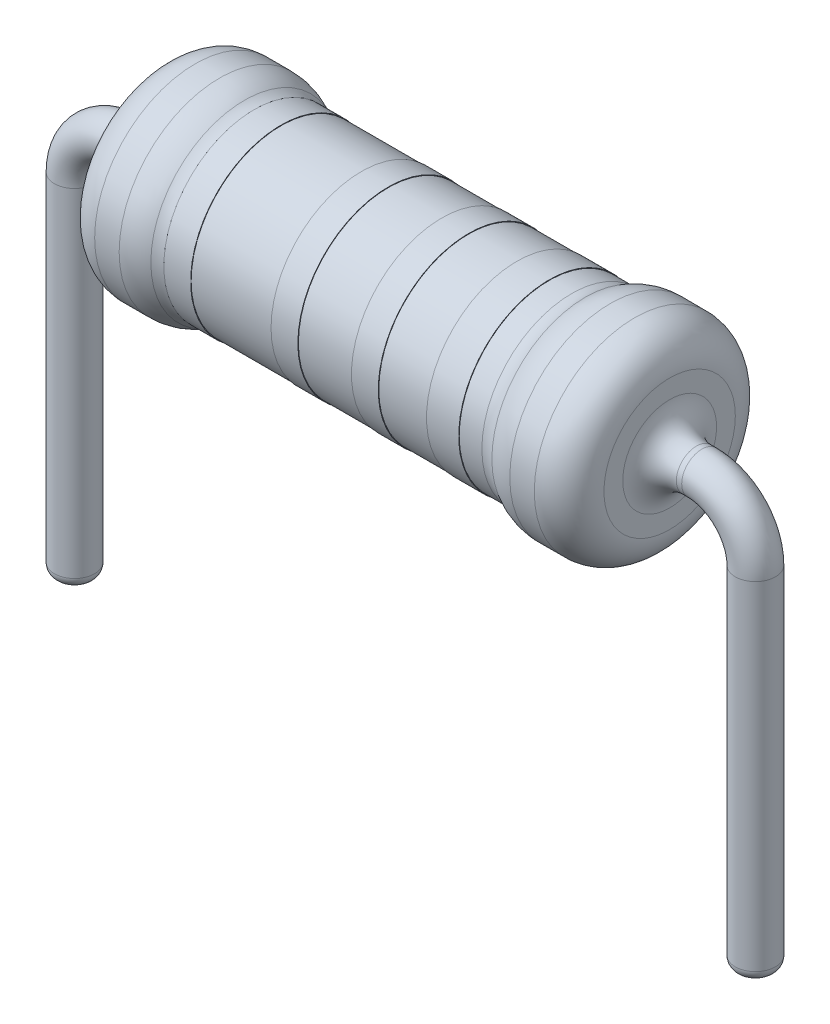
ISO-10303-21;
HEADER;
FILE_DESCRIPTION(('STEP AP214'),'2;1');
FILE_NAME('part.step','',(''),(''),'','','');
FILE_SCHEMA(('AUTOMOTIVE_DESIGN { 1 0 10303 214 1 1 1 1 }'));
ENDSEC;
DATA;
#1=APPLICATION_CONTEXT('core data for automotive mechanical design processes');
#2=APPLICATION_PROTOCOL_DEFINITION('international standard','automotive_design',2000,#1);
#3=PRODUCT_CONTEXT('',#1,'mechanical');
#4=PRODUCT('Part','Part','',(#3));
#5=PRODUCT_RELATED_PRODUCT_CATEGORY('part','',(#4));
#6=PRODUCT_DEFINITION_FORMATION('','',#4);
#7=PRODUCT_DEFINITION_CONTEXT('part definition',#1,'design');
#8=PRODUCT_DEFINITION('design','',#6,#7);
#9=PRODUCT_DEFINITION_SHAPE('','',#8);
#10=(LENGTH_UNIT() NAMED_UNIT(*) SI_UNIT(.MILLI.,.METRE.));
#11=(NAMED_UNIT(*) PLANE_ANGLE_UNIT() SI_UNIT($,.RADIAN.));
#12=(NAMED_UNIT(*) SI_UNIT($,.STERADIAN.) SOLID_ANGLE_UNIT());
#13=UNCERTAINTY_MEASURE_WITH_UNIT(LENGTH_MEASURE(1.E-05),#10,'distance_accuracy_value','');
#14=(GEOMETRIC_REPRESENTATION_CONTEXT(3) GLOBAL_UNCERTAINTY_ASSIGNED_CONTEXT((#13)) GLOBAL_UNIT_ASSIGNED_CONTEXT((#10,
#11,#12)) REPRESENTATION_CONTEXT('',''));
#15=CARTESIAN_POINT('',(0.,0.,0.));
#16=DIRECTION('',(0.,0.,1.));
#17=DIRECTION('',(1.,0.,0.));
#18=AXIS2_PLACEMENT_3D('',#15,#16,#17);
#19=CARTESIAN_POINT('',(6.35,0.,0.));
#20=DIRECTION('',(0.,-1.,0.));
#21=DIRECTION('',(0.,0.,-1.));
#22=AXIS2_PLACEMENT_3D('',#19,#20,#21);
#23=PLANE('',#22);
#24=CARTESIAN_POINT('',(6.35,0.,0.));
#25=DIRECTION('',(0.,-1.,0.));
#26=DIRECTION('',(0.,0.,-1.));
#27=AXIS2_PLACEMENT_3D('',#24,#25,#26);
#28=CIRCLE('',#27,0.175);
#29=CARTESIAN_POINT('',(6.35,0.,-0.174999999999999));
#30=VERTEX_POINT('',#29);
#31=EDGE_CURVE('E18',#30,#30,#28,.F.);
#32=ORIENTED_EDGE('',*,*,#31,.F.);
#33=EDGE_LOOP('',(#32));
#34=FACE_BOUND('',#33,.T.);
#35=ADVANCED_FACE('F14',(#34),#23,.T.);
#36=CARTESIAN_POINT('',(6.35,0.2,0.));
#37=DIRECTION('',(0.,-1.,0.));
#38=DIRECTION('',(0.,0.,-1.));
#39=AXIS2_PLACEMENT_3D('',#36,#37,#38);
#40=DEGENERATE_TOROIDAL_SURFACE('',#39,0.175,0.2,.T.);
#41=CARTESIAN_POINT('',(6.35,0.2,0.));
#42=DIRECTION('',(0.,1.,0.));
#43=DIRECTION('',(0.,0.,1.));
#44=AXIS2_PLACEMENT_3D('',#41,#42,#43);
#45=CIRCLE('',#44,0.375);
#46=CARTESIAN_POINT('',(6.35,0.2,0.375000000000002));
#47=VERTEX_POINT('',#46);
#48=EDGE_CURVE('E30',#47,#47,#45,.T.);
#49=ORIENTED_EDGE('',*,*,#48,.F.);
#50=EDGE_LOOP('',(#49));
#51=FACE_BOUND('',#50,.T.);
#52=ORIENTED_EDGE('',*,*,#31,.T.);
#53=EDGE_LOOP('',(#52));
#54=FACE_BOUND('',#53,.T.);
#55=ADVANCED_FACE('F122',(#51,#54),#40,.T.);
#56=CARTESIAN_POINT('',(6.35,0.,0.));
#57=DIRECTION('',(0.,1.,0.));
#58=DIRECTION('',(0.,0.,1.));
#59=AXIS2_PLACEMENT_3D('',#56,#57,#58);
#60=CYLINDRICAL_SURFACE('',#59,0.375);
#61=ORIENTED_EDGE('',*,*,#48,.T.);
#62=EDGE_LOOP('',(#61));
#63=FACE_BOUND('',#62,.T.);
#64=CARTESIAN_POINT('',(6.35,6.5,0.));
#65=DIRECTION('',(0.,1.,0.));
#66=DIRECTION('',(1.,0.,0.));
#67=AXIS2_PLACEMENT_3D('',#64,#65,#66);
#68=CIRCLE('',#67,0.375);
#69=CARTESIAN_POINT('',(6.725,6.5,0.));
#70=VERTEX_POINT('',#69);
#71=EDGE_CURVE('E105',#70,#70,#68,.T.);
#72=ORIENTED_EDGE('',*,*,#71,.F.);
#73=EDGE_LOOP('',(#72));
#74=FACE_BOUND('',#73,.T.);
#75=ADVANCED_FACE('F117',(#63,#74),#60,.T.);
#76=CARTESIAN_POINT('',(5.35,6.5,0.));
#77=DIRECTION('',(0.,0.,1.));
#78=DIRECTION('',(1.,0.,0.));
#79=AXIS2_PLACEMENT_3D('',#76,#77,#78);
#80=TOROIDAL_SURFACE('',#79,1.,0.375);
#81=ORIENTED_EDGE('',*,*,#71,.T.);
#82=EDGE_LOOP('',(#81));
#83=FACE_BOUND('',#82,.T.);
#84=CARTESIAN_POINT('',(5.35,7.50000000000001,0.));
#85=DIRECTION('',(-1.,0.,0.));
#86=DIRECTION('',(0.,0.,1.));
#87=AXIS2_PLACEMENT_3D('',#84,#85,#86);
#88=CIRCLE('',#87,0.375);
#89=CARTESIAN_POINT('',(5.35,7.50000000000001,0.375));
#90=VERTEX_POINT('',#89);
#91=EDGE_CURVE('E100',#90,#90,#88,.T.);
#92=ORIENTED_EDGE('',*,*,#91,.F.);
#93=EDGE_LOOP('',(#92));
#94=FACE_BOUND('',#93,.T.);
#95=ADVANCED_FACE('F112',(#83,#94),#80,.T.);
#96=CARTESIAN_POINT('',(5.35,7.50000000000001,0.));
#97=DIRECTION('',(-1.,0.,0.));
#98=DIRECTION('',(0.,0.,1.));
#99=AXIS2_PLACEMENT_3D('',#96,#97,#98);
#100=CYLINDRICAL_SURFACE('',#99,0.375);
#101=CARTESIAN_POINT('',(5.25,7.50000000000001,0.));
#102=DIRECTION('',(1.,0.,0.));
#103=DIRECTION('',(0.,0.,-1.));
#104=AXIS2_PLACEMENT_3D('',#101,#102,#103);
#105=CIRCLE('',#104,0.375);
#106=CARTESIAN_POINT('',(5.25,7.50000000000001,-0.375));
#107=VERTEX_POINT('',#106);
#108=EDGE_CURVE('E96',#107,#107,#105,.T.);
#109=ORIENTED_EDGE('',*,*,#108,.T.);
#110=EDGE_LOOP('',(#109));
#111=FACE_BOUND('',#110,.T.);
#112=ORIENTED_EDGE('',*,*,#91,.T.);
#113=EDGE_LOOP('',(#112));
#114=FACE_BOUND('',#113,.T.);
#115=ADVANCED_FACE('F116',(#111,#114),#100,.T.);
#116=CARTESIAN_POINT('',(5.25,7.50000000000001,0.));
#117=DIRECTION('',(1.,0.,0.));
#118=DIRECTION('',(0.,0.,-1.));
#119=AXIS2_PLACEMENT_3D('',#116,#117,#118);
#120=TOROIDAL_SURFACE('',#119,0.875,0.5);
#121=ORIENTED_EDGE('',*,*,#108,.F.);
#122=EDGE_LOOP('',(#121));
#123=FACE_BOUND('',#122,.T.);
#124=CARTESIAN_POINT('',(4.75,7.50000000000001,0.));
#125=DIRECTION('',(1.,0.,0.));
#126=DIRECTION('',(0.,0.,-1.));
#127=AXIS2_PLACEMENT_3D('',#124,#125,#126);
#128=CIRCLE('',#127,0.875);
#129=CARTESIAN_POINT('',(4.75,7.50000000000001,-0.875));
#130=VERTEX_POINT('',#129);
#131=EDGE_CURVE('E94',#130,#130,#128,.F.);
#132=ORIENTED_EDGE('',*,*,#131,.F.);
#133=EDGE_LOOP('',(#132));
#134=FACE_BOUND('',#133,.T.);
#135=ADVANCED_FACE('F130',(#123,#134),#120,.F.);
#136=CARTESIAN_POINT('',(4.75,0.,0.));
#137=DIRECTION('',(1.,0.,0.));
#138=DIRECTION('',(0.,0.,-1.));
#139=AXIS2_PLACEMENT_3D('',#136,#137,#138);
#140=PLANE('',#139);
#141=CARTESIAN_POINT('',(4.75,7.5,0.));
#142=DIRECTION('',(1.,0.,0.));
#143=DIRECTION('',(0.,0.,-1.));
#144=AXIS2_PLACEMENT_3D('',#141,#142,#143);
#145=CIRCLE('',#144,1.225);
#146=CARTESIAN_POINT('',(4.75,7.5,-1.225));
#147=VERTEX_POINT('',#146);
#148=EDGE_CURVE('E91',#147,#147,#145,.F.);
#149=ORIENTED_EDGE('',*,*,#148,.F.);
#150=EDGE_LOOP('',(#149));
#151=FACE_BOUND('',#150,.T.);
#152=ORIENTED_EDGE('',*,*,#131,.T.);
#153=EDGE_LOOP('',(#152));
#154=FACE_BOUND('',#153,.T.);
#155=ADVANCED_FACE('F133',(#151,#154),#140,.T.);
#156=CARTESIAN_POINT('',(4.1,7.5,0.));
#157=DIRECTION('',(1.,0.,0.));
#158=DIRECTION('',(0.,0.,-1.));
#159=AXIS2_PLACEMENT_3D('',#156,#157,#158);
#160=TOROIDAL_SURFACE('',#159,1.225,0.65);
#161=CARTESIAN_POINT('',(4.1,7.5,0.));
#162=DIRECTION('',(-1.,0.,0.));
#163=DIRECTION('',(0.,0.,1.));
#164=AXIS2_PLACEMENT_3D('',#161,#162,#163);
#165=CIRCLE('',#164,1.875);
#166=CARTESIAN_POINT('',(4.1,7.5,1.875));
#167=VERTEX_POINT('',#166);
#168=EDGE_CURVE('E93',#167,#167,#165,.T.);
#169=ORIENTED_EDGE('',*,*,#168,.F.);
#170=EDGE_LOOP('',(#169));
#171=FACE_BOUND('',#170,.T.);
#172=ORIENTED_EDGE('',*,*,#148,.T.);
#173=EDGE_LOOP('',(#172));
#174=FACE_BOUND('',#173,.T.);
#175=ADVANCED_FACE('F135',(#171,#174),#160,.T.);
#176=CARTESIAN_POINT('',(-4.75,7.5,0.));
#177=DIRECTION('',(-1.,0.,0.));
#178=DIRECTION('',(0.,0.,1.));
#179=AXIS2_PLACEMENT_3D('',#176,#177,#178);
#180=CYLINDRICAL_SURFACE('',#179,1.875);
#181=ORIENTED_EDGE('',*,*,#168,.T.);
#182=EDGE_LOOP('',(#181));
#183=FACE_BOUND('',#182,.T.);
#184=CARTESIAN_POINT('',(3.64302352755487,7.5,0.));
#185=DIRECTION('',(-1.,0.,0.));
#186=DIRECTION('',(0.,0.,1.));
#187=AXIS2_PLACEMENT_3D('',#184,#185,#186);
#188=CIRCLE('',#187,1.875);
#189=CARTESIAN_POINT('',(3.64302352755487,7.5,1.875));
#190=VERTEX_POINT('',#189);
#191=EDGE_CURVE('E90',#190,#190,#188,.T.);
#192=ORIENTED_EDGE('',*,*,#191,.F.);
#193=EDGE_LOOP('',(#192));
#194=FACE_BOUND('',#193,.T.);
#195=ADVANCED_FACE('F138',(#183,#194),#180,.T.);
#196=CARTESIAN_POINT('',(-6.35,0.,0.));
#197=DIRECTION('',(0.,-1.,0.));
#198=DIRECTION('',(0.,0.,-1.));
#199=AXIS2_PLACEMENT_3D('',#196,#197,#198);
#200=PLANE('',#199);
#201=CARTESIAN_POINT('',(-6.35,0.,0.));
#202=DIRECTION('',(0.,-1.,0.));
#203=DIRECTION('',(0.,0.,-1.));
#204=AXIS2_PLACEMENT_3D('',#201,#202,#203);
#205=CIRCLE('',#204,0.175);
#206=CARTESIAN_POINT('',(-6.35,0.,-0.175));
#207=VERTEX_POINT('',#206);
#208=EDGE_CURVE('E86',#207,#207,#205,.F.);
#209=ORIENTED_EDGE('',*,*,#208,.F.);
#210=EDGE_LOOP('',(#209));
#211=FACE_BOUND('',#210,.T.);
#212=ADVANCED_FACE('F250',(#211),#200,.T.);
#213=CARTESIAN_POINT('',(3.64302352755487,7.5,0.));
#214=DIRECTION('',(-1.,0.,0.));
#215=DIRECTION('',(0.,0.,1.));
#216=AXIS2_PLACEMENT_3D('',#213,#214,#215);
#217=TOROIDAL_SURFACE('',#216,0.977263692076684,0.897736307923315);
#218=ORIENTED_EDGE('',*,*,#191,.T.);
#219=EDGE_LOOP('',(#218));
#220=FACE_BOUND('',#219,.T.);
#221=CARTESIAN_POINT('',(3.18027316591826,7.5,0.));
#222=DIRECTION('',(1.,0.,0.));
#223=DIRECTION('',(0.,0.,-1.));
#224=AXIS2_PLACEMENT_3D('',#221,#222,#223);
#225=CIRCLE('',#224,1.74654425297041);
#226=CARTESIAN_POINT('',(3.18027316591826,7.5,-1.74654425297041));
#227=VERTEX_POINT('',#226);
#228=EDGE_CURVE('E89',#227,#227,#225,.T.);
#229=ORIENTED_EDGE('',*,*,#228,.T.);
#230=EDGE_LOOP('',(#229));
#231=FACE_BOUND('',#230,.T.);
#232=ADVANCED_FACE('F144',(#220,#231),#217,.T.);
#233=CARTESIAN_POINT('',(-6.35,0.200000000000001,0.));
#234=DIRECTION('',(0.,-1.,0.));
#235=DIRECTION('',(0.,0.,-1.));
#236=AXIS2_PLACEMENT_3D('',#233,#234,#235);
#237=DEGENERATE_TOROIDAL_SURFACE('',#236,0.175,0.2,.T.);
#238=ORIENTED_EDGE('',*,*,#208,.T.);
#239=EDGE_LOOP('',(#238));
#240=FACE_BOUND('',#239,.T.);
#241=CARTESIAN_POINT('',(-6.35,0.200000000000001,0.));
#242=DIRECTION('',(0.,1.,0.));
#243=DIRECTION('',(0.,0.,1.));
#244=AXIS2_PLACEMENT_3D('',#241,#242,#243);
#245=CIRCLE('',#244,0.375);
#246=CARTESIAN_POINT('',(-6.35,0.200000000000001,0.375));
#247=VERTEX_POINT('',#246);
#248=EDGE_CURVE('E256',#247,#247,#245,.T.);
#249=ORIENTED_EDGE('',*,*,#248,.F.);
#250=EDGE_LOOP('',(#249));
#251=FACE_BOUND('',#250,.T.);
#252=ADVANCED_FACE('F140',(#240,#251),#237,.T.);
#253=CARTESIAN_POINT('',(2.92254138123248,7.5,0.));
#254=DIRECTION('',(-1.,0.,0.));
#255=DIRECTION('',(0.,0.,1.));
#256=AXIS2_PLACEMENT_3D('',#253,#254,#255);
#257=TOROIDAL_SURFACE('',#256,2.17499999999999,0.499999999999995);
#258=ORIENTED_EDGE('',*,*,#228,.F.);
#259=EDGE_LOOP('',(#258));
#260=FACE_BOUND('',#259,.T.);
#261=CARTESIAN_POINT('',(2.92254138123248,7.5,0.));
#262=DIRECTION('',(-1.,0.,0.));
#263=DIRECTION('',(0.,0.,1.));
#264=AXIS2_PLACEMENT_3D('',#261,#262,#263);
#265=CIRCLE('',#264,1.675);
#266=CARTESIAN_POINT('',(2.92254138123248,7.5,1.675));
#267=VERTEX_POINT('',#266);
#268=EDGE_CURVE('E258',#267,#267,#265,.T.);
#269=ORIENTED_EDGE('',*,*,#268,.F.);
#270=EDGE_LOOP('',(#269));
#271=FACE_BOUND('',#270,.T.);
#272=ADVANCED_FACE('F143',(#260,#271),#257,.F.);
#273=CARTESIAN_POINT('',(-6.35,0.,0.));
#274=DIRECTION('',(0.,1.,0.));
#275=DIRECTION('',(0.,0.,1.));
#276=AXIS2_PLACEMENT_3D('',#273,#274,#275);
#277=CYLINDRICAL_SURFACE('',#276,0.375);
#278=CARTESIAN_POINT('',(-6.35,6.5,0.));
#279=DIRECTION('',(0.,1.,0.));
#280=DIRECTION('',(-1.,0.,0.));
#281=AXIS2_PLACEMENT_3D('',#278,#279,#280);
#282=CIRCLE('',#281,0.375);
#283=CARTESIAN_POINT('',(-6.725,6.5,0.));
#284=VERTEX_POINT('',#283);
#285=EDGE_CURVE('E85',#284,#284,#282,.T.);
#286=ORIENTED_EDGE('',*,*,#285,.F.);
#287=EDGE_LOOP('',(#286));
#288=FACE_BOUND('',#287,.T.);
#289=ORIENTED_EDGE('',*,*,#248,.T.);
#290=EDGE_LOOP('',(#289));
#291=FACE_BOUND('',#290,.T.);
#292=ADVANCED_FACE('F148',(#288,#291),#277,.T.);
#293=CARTESIAN_POINT('',(-4.75,7.5,0.));
#294=DIRECTION('',(-1.,0.,0.));
#295=DIRECTION('',(0.,0.,1.));
#296=AXIS2_PLACEMENT_3D('',#293,#294,#295);
#297=CYLINDRICAL_SURFACE('',#296,1.675);
#298=ORIENTED_EDGE('',*,*,#268,.T.);
#299=EDGE_LOOP('',(#298));
#300=FACE_BOUND('',#299,.T.);
#301=CARTESIAN_POINT('',(2.5,7.5,0.));
#302=DIRECTION('',(-1.,0.,0.));
#303=DIRECTION('',(0.,0.,1.));
#304=AXIS2_PLACEMENT_3D('',#301,#302,#303);
#305=CIRCLE('',#304,1.675);
#306=CARTESIAN_POINT('',(2.5,7.5,1.675));
#307=VERTEX_POINT('',#306);
#308=EDGE_CURVE('E82',#307,#307,#305,.T.);
#309=ORIENTED_EDGE('',*,*,#308,.F.);
#310=EDGE_LOOP('',(#309));
#311=FACE_BOUND('',#310,.T.);
#312=ADVANCED_FACE('F239',(#300,#311),#297,.T.);
#313=CARTESIAN_POINT('',(2.5,7.5,0.));
#314=DIRECTION('',(1.,0.,0.));
#315=DIRECTION('',(0.,0.,-1.));
#316=AXIS2_PLACEMENT_3D('',#313,#314,#315);
#317=PLANE('',#316);
#318=ORIENTED_EDGE('',*,*,#308,.T.);
#319=EDGE_LOOP('',(#318));
#320=FACE_BOUND('',#319,.T.);
#321=CARTESIAN_POINT('',(2.5,7.5,0.));
#322=DIRECTION('',(1.,0.,0.));
#323=DIRECTION('',(0.,0.,-1.));
#324=AXIS2_PLACEMENT_3D('',#321,#322,#323);
#325=CIRCLE('',#324,1.685);
#326=CARTESIAN_POINT('',(2.5,7.5,-1.685));
#327=VERTEX_POINT('',#326);
#328=EDGE_CURVE('E79',#327,#327,#325,.F.);
#329=ORIENTED_EDGE('',*,*,#328,.F.);
#330=EDGE_LOOP('',(#329));
#331=FACE_BOUND('',#330,.T.);
#332=ADVANCED_FACE('F234',(#320,#331),#317,.T.);
#333=CARTESIAN_POINT('',(-5.35,6.5,0.));
#334=DIRECTION('',(0.,0.,-1.));
#335=DIRECTION('',(-1.,0.,0.));
#336=AXIS2_PLACEMENT_3D('',#333,#334,#335);
#337=TOROIDAL_SURFACE('',#336,1.,0.375);
#338=ORIENTED_EDGE('',*,*,#285,.T.);
#339=EDGE_LOOP('',(#338));
#340=FACE_BOUND('',#339,.T.);
#341=CARTESIAN_POINT('',(-5.35,7.50000000000001,0.));
#342=DIRECTION('',(1.,0.,0.));
#343=DIRECTION('',(0.,0.,-1.));
#344=AXIS2_PLACEMENT_3D('',#341,#342,#343);
#345=CIRCLE('',#344,0.375);
#346=CARTESIAN_POINT('',(-5.35,7.50000000000001,-0.375));
#347=VERTEX_POINT('',#346);
#348=EDGE_CURVE('E78',#347,#347,#345,.T.);
#349=ORIENTED_EDGE('',*,*,#348,.F.);
#350=EDGE_LOOP('',(#349));
#351=FACE_BOUND('',#350,.T.);
#352=ADVANCED_FACE('F229',(#340,#351),#337,.T.);
#353=CARTESIAN_POINT('',(1.9,7.5,0.));
#354=DIRECTION('',(1.,0.,0.));
#355=DIRECTION('',(0.,0.,-1.));
#356=AXIS2_PLACEMENT_3D('',#353,#354,#355);
#357=CYLINDRICAL_SURFACE('',#356,1.685);
#358=ORIENTED_EDGE('',*,*,#328,.T.);
#359=EDGE_LOOP('',(#358));
#360=FACE_BOUND('',#359,.T.);
#361=CARTESIAN_POINT('',(1.9,7.5,0.));
#362=DIRECTION('',(1.,0.,0.));
#363=DIRECTION('',(0.,0.,-1.));
#364=AXIS2_PLACEMENT_3D('',#361,#362,#363);
#365=CIRCLE('',#364,1.685);
#366=CARTESIAN_POINT('',(1.9,7.5,-1.685));
#367=VERTEX_POINT('',#366);
#368=EDGE_CURVE('E75',#367,#367,#365,.T.);
#369=ORIENTED_EDGE('',*,*,#368,.T.);
#370=EDGE_LOOP('',(#369));
#371=FACE_BOUND('',#370,.T.);
#372=ADVANCED_FACE('F233',(#360,#371),#357,.T.);
#373=CARTESIAN_POINT('',(-5.35,7.50000000000001,0.));
#374=DIRECTION('',(1.,0.,0.));
#375=DIRECTION('',(0.,0.,-1.));
#376=AXIS2_PLACEMENT_3D('',#373,#374,#375);
#377=CYLINDRICAL_SURFACE('',#376,0.375);
#378=CARTESIAN_POINT('',(-5.25,7.50000000000001,0.));
#379=DIRECTION('',(-1.,0.,0.));
#380=DIRECTION('',(0.,0.,1.));
#381=AXIS2_PLACEMENT_3D('',#378,#379,#380);
#382=CIRCLE('',#381,0.375);
#383=CARTESIAN_POINT('',(-5.25,7.50000000000001,0.375));
#384=VERTEX_POINT('',#383);
#385=EDGE_CURVE('E74',#384,#384,#382,.T.);
#386=ORIENTED_EDGE('',*,*,#385,.T.);
#387=EDGE_LOOP('',(#386));
#388=FACE_BOUND('',#387,.T.);
#389=ORIENTED_EDGE('',*,*,#348,.T.);
#390=EDGE_LOOP('',(#389));
#391=FACE_BOUND('',#390,.T.);
#392=ADVANCED_FACE('F318',(#388,#391),#377,.T.);
#393=CARTESIAN_POINT('',(1.9,7.5,0.));
#394=DIRECTION('',(1.,0.,0.));
#395=DIRECTION('',(0.,0.,-1.));
#396=AXIS2_PLACEMENT_3D('',#393,#394,#395);
#397=PLANE('',#396);
#398=CARTESIAN_POINT('',(1.9,7.5,0.));
#399=DIRECTION('',(-1.,0.,0.));
#400=DIRECTION('',(0.,0.,1.));
#401=AXIS2_PLACEMENT_3D('',#398,#399,#400);
#402=CIRCLE('',#401,1.675);
#403=CARTESIAN_POINT('',(1.9,7.5,1.675));
#404=VERTEX_POINT('',#403);
#405=EDGE_CURVE('E71',#404,#404,#402,.T.);
#406=ORIENTED_EDGE('',*,*,#405,.F.);
#407=EDGE_LOOP('',(#406));
#408=FACE_BOUND('',#407,.T.);
#409=ORIENTED_EDGE('',*,*,#368,.F.);
#410=EDGE_LOOP('',(#409));
#411=FACE_BOUND('',#410,.T.);
#412=ADVANCED_FACE('F153',(#408,#411),#397,.F.);
#413=CARTESIAN_POINT('',(-5.25,7.50000000000001,0.));
#414=DIRECTION('',(-1.,0.,0.));
#415=DIRECTION('',(0.,0.,1.));
#416=AXIS2_PLACEMENT_3D('',#413,#414,#415);
#417=TOROIDAL_SURFACE('',#416,0.875,0.5);
#418=ORIENTED_EDGE('',*,*,#385,.F.);
#419=EDGE_LOOP('',(#418));
#420=FACE_BOUND('',#419,.T.);
#421=CARTESIAN_POINT('',(-4.75,7.50000000000001,0.));
#422=DIRECTION('',(-1.,0.,0.));
#423=DIRECTION('',(0.,0.,1.));
#424=AXIS2_PLACEMENT_3D('',#421,#422,#423);
#425=CIRCLE('',#424,0.875);
#426=CARTESIAN_POINT('',(-4.75,7.50000000000001,0.875));
#427=VERTEX_POINT('',#426);
#428=EDGE_CURVE('E68',#427,#427,#425,.F.);
#429=ORIENTED_EDGE('',*,*,#428,.F.);
#430=EDGE_LOOP('',(#429));
#431=FACE_BOUND('',#430,.T.);
#432=ADVANCED_FACE('F150',(#420,#431),#417,.F.);
#433=CARTESIAN_POINT('',(-4.75,7.5,0.));
#434=DIRECTION('',(-1.,0.,0.));
#435=DIRECTION('',(0.,0.,1.));
#436=AXIS2_PLACEMENT_3D('',#433,#434,#435);
#437=CYLINDRICAL_SURFACE('',#436,1.675);
#438=ORIENTED_EDGE('',*,*,#405,.T.);
#439=EDGE_LOOP('',(#438));
#440=FACE_BOUND('',#439,.T.);
#441=CARTESIAN_POINT('',(1.,7.5,0.));
#442=DIRECTION('',(-1.,0.,0.));
#443=DIRECTION('',(0.,0.,1.));
#444=AXIS2_PLACEMENT_3D('',#441,#442,#443);
#445=CIRCLE('',#444,1.675);
#446=CARTESIAN_POINT('',(1.,7.5,1.675));
#447=VERTEX_POINT('',#446);
#448=EDGE_CURVE('E65',#447,#447,#445,.T.);
#449=ORIENTED_EDGE('',*,*,#448,.F.);
#450=EDGE_LOOP('',(#449));
#451=FACE_BOUND('',#450,.T.);
#452=ADVANCED_FACE('F152',(#440,#451),#437,.T.);
#453=CARTESIAN_POINT('',(-4.75,0.,0.));
#454=DIRECTION('',(-1.,0.,0.));
#455=DIRECTION('',(0.,0.,1.));
#456=AXIS2_PLACEMENT_3D('',#453,#454,#455);
#457=PLANE('',#456);
#458=CARTESIAN_POINT('',(-4.75,7.5,0.));
#459=DIRECTION('',(-1.,0.,0.));
#460=DIRECTION('',(0.,0.,1.));
#461=AXIS2_PLACEMENT_3D('',#458,#459,#460);
#462=CIRCLE('',#461,1.225);
#463=CARTESIAN_POINT('',(-4.75,7.5,1.225));
#464=VERTEX_POINT('',#463);
#465=EDGE_CURVE('E62',#464,#464,#462,.F.);
#466=ORIENTED_EDGE('',*,*,#465,.F.);
#467=EDGE_LOOP('',(#466));
#468=FACE_BOUND('',#467,.T.);
#469=ORIENTED_EDGE('',*,*,#428,.T.);
#470=EDGE_LOOP('',(#469));
#471=FACE_BOUND('',#470,.T.);
#472=ADVANCED_FACE('F168',(#468,#471),#457,.T.);
#473=CARTESIAN_POINT('',(1.,7.50000000000001,0.));
#474=DIRECTION('',(1.,0.,0.));
#475=DIRECTION('',(0.,0.,-1.));
#476=AXIS2_PLACEMENT_3D('',#473,#474,#475);
#477=PLANE('',#476);
#478=ORIENTED_EDGE('',*,*,#448,.T.);
#479=EDGE_LOOP('',(#478));
#480=FACE_BOUND('',#479,.T.);
#481=CARTESIAN_POINT('',(1.,7.50000000000001,0.));
#482=DIRECTION('',(1.,0.,0.));
#483=DIRECTION('',(0.,0.,-1.));
#484=AXIS2_PLACEMENT_3D('',#481,#482,#483);
#485=CIRCLE('',#484,1.685);
#486=CARTESIAN_POINT('',(1.,7.50000000000001,-1.685));
#487=VERTEX_POINT('',#486);
#488=EDGE_CURVE('E59',#487,#487,#485,.F.);
#489=ORIENTED_EDGE('',*,*,#488,.F.);
#490=EDGE_LOOP('',(#489));
#491=FACE_BOUND('',#490,.T.);
#492=ADVANCED_FACE('F158',(#480,#491),#477,.T.);
#493=CARTESIAN_POINT('',(-4.1,7.5,0.));
#494=DIRECTION('',(-1.,0.,0.));
#495=DIRECTION('',(0.,0.,1.));
#496=AXIS2_PLACEMENT_3D('',#493,#494,#495);
#497=TOROIDAL_SURFACE('',#496,1.225,0.65);
#498=ORIENTED_EDGE('',*,*,#465,.T.);
#499=EDGE_LOOP('',(#498));
#500=FACE_BOUND('',#499,.T.);
#501=CARTESIAN_POINT('',(-4.1,7.5,0.));
#502=DIRECTION('',(-1.,0.,0.));
#503=DIRECTION('',(0.,0.,1.));
#504=AXIS2_PLACEMENT_3D('',#501,#502,#503);
#505=CIRCLE('',#504,1.875);
#506=CARTESIAN_POINT('',(-4.1,7.5,1.875));
#507=VERTEX_POINT('',#506);
#508=EDGE_CURVE('E58',#507,#507,#505,.F.);
#509=ORIENTED_EDGE('',*,*,#508,.F.);
#510=EDGE_LOOP('',(#509));
#511=FACE_BOUND('',#510,.T.);
#512=ADVANCED_FACE('F155',(#500,#511),#497,.T.);
#513=CARTESIAN_POINT('',(0.5,7.50000000000001,0.));
#514=DIRECTION('',(1.,0.,0.));
#515=DIRECTION('',(0.,0.,-1.));
#516=AXIS2_PLACEMENT_3D('',#513,#514,#515);
#517=CYLINDRICAL_SURFACE('',#516,1.685);
#518=ORIENTED_EDGE('',*,*,#488,.T.);
#519=EDGE_LOOP('',(#518));
#520=FACE_BOUND('',#519,.T.);
#521=CARTESIAN_POINT('',(0.5,7.50000000000001,0.));
#522=DIRECTION('',(1.,0.,0.));
#523=DIRECTION('',(0.,0.,-1.));
#524=AXIS2_PLACEMENT_3D('',#521,#522,#523);
#525=CIRCLE('',#524,1.685);
#526=CARTESIAN_POINT('',(0.5,7.50000000000001,-1.685));
#527=VERTEX_POINT('',#526);
#528=EDGE_CURVE('E55',#527,#527,#525,.T.);
#529=ORIENTED_EDGE('',*,*,#528,.T.);
#530=EDGE_LOOP('',(#529));
#531=FACE_BOUND('',#530,.T.);
#532=ADVANCED_FACE('F157',(#520,#531),#517,.T.);
#533=CARTESIAN_POINT('',(-4.75,7.5,0.));
#534=DIRECTION('',(-1.,0.,0.));
#535=DIRECTION('',(0.,0.,1.));
#536=AXIS2_PLACEMENT_3D('',#533,#534,#535);
#537=CYLINDRICAL_SURFACE('',#536,1.875);
#538=ORIENTED_EDGE('',*,*,#508,.T.);
#539=EDGE_LOOP('',(#538));
#540=FACE_BOUND('',#539,.T.);
#541=CARTESIAN_POINT('',(-3.64302352755487,7.5,0.));
#542=DIRECTION('',(-1.,0.,0.));
#543=DIRECTION('',(0.,0.,1.));
#544=AXIS2_PLACEMENT_3D('',#541,#542,#543);
#545=CIRCLE('',#544,1.875);
#546=CARTESIAN_POINT('',(-3.64302352755487,7.5,1.875));
#547=VERTEX_POINT('',#546);
#548=EDGE_CURVE('E54',#547,#547,#545,.F.);
#549=ORIENTED_EDGE('',*,*,#548,.F.);
#550=EDGE_LOOP('',(#549));
#551=FACE_BOUND('',#550,.T.);
#552=ADVANCED_FACE('F165',(#540,#551),#537,.T.);
#553=CARTESIAN_POINT('',(0.5,7.50000000000001,0.));
#554=DIRECTION('',(1.,0.,0.));
#555=DIRECTION('',(0.,0.,-1.));
#556=AXIS2_PLACEMENT_3D('',#553,#554,#555);
#557=PLANE('',#556);
#558=CARTESIAN_POINT('',(0.5,7.5,0.));
#559=DIRECTION('',(-1.,0.,0.));
#560=DIRECTION('',(0.,0.,1.));
#561=AXIS2_PLACEMENT_3D('',#558,#559,#560);
#562=CIRCLE('',#561,1.675);
#563=CARTESIAN_POINT('',(0.5,7.5,1.675));
#564=VERTEX_POINT('',#563);
#565=EDGE_CURVE('E51',#564,#564,#562,.T.);
#566=ORIENTED_EDGE('',*,*,#565,.F.);
#567=EDGE_LOOP('',(#566));
#568=FACE_BOUND('',#567,.T.);
#569=ORIENTED_EDGE('',*,*,#528,.F.);
#570=EDGE_LOOP('',(#569));
#571=FACE_BOUND('',#570,.T.);
#572=ADVANCED_FACE('F211',(#568,#571),#557,.F.);
#573=CARTESIAN_POINT('',(-3.64302352755487,7.5,0.));
#574=DIRECTION('',(-1.,0.,0.));
#575=DIRECTION('',(0.,0.,1.));
#576=AXIS2_PLACEMENT_3D('',#573,#574,#575);
#577=TOROIDAL_SURFACE('',#576,0.977263692076682,0.897736307923316);
#578=ORIENTED_EDGE('',*,*,#548,.T.);
#579=EDGE_LOOP('',(#578));
#580=FACE_BOUND('',#579,.T.);
#581=CARTESIAN_POINT('',(-3.18027316591826,7.5,0.));
#582=DIRECTION('',(-1.,0.,0.));
#583=DIRECTION('',(0.,0.,1.));
#584=AXIS2_PLACEMENT_3D('',#581,#582,#583);
#585=CIRCLE('',#584,1.74654425297041);
#586=CARTESIAN_POINT('',(-3.18027316591826,7.5,1.74654425297041));
#587=VERTEX_POINT('',#586);
#588=EDGE_CURVE('E50',#587,#587,#585,.T.);
#589=ORIENTED_EDGE('',*,*,#588,.T.);
#590=EDGE_LOOP('',(#589));
#591=FACE_BOUND('',#590,.T.);
#592=ADVANCED_FACE('F206',(#580,#591),#577,.T.);
#593=CARTESIAN_POINT('',(-4.75,7.5,0.));
#594=DIRECTION('',(-1.,0.,0.));
#595=DIRECTION('',(0.,0.,1.));
#596=AXIS2_PLACEMENT_3D('',#593,#594,#595);
#597=CYLINDRICAL_SURFACE('',#596,1.675);
#598=ORIENTED_EDGE('',*,*,#565,.T.);
#599=EDGE_LOOP('',(#598));
#600=FACE_BOUND('',#599,.T.);
#601=CARTESIAN_POINT('',(-0.5,7.5,0.));
#602=DIRECTION('',(-1.,0.,0.));
#603=DIRECTION('',(0.,0.,1.));
#604=AXIS2_PLACEMENT_3D('',#601,#602,#603);
#605=CIRCLE('',#604,1.675);
#606=CARTESIAN_POINT('',(-0.5,7.5,1.675));
#607=VERTEX_POINT('',#606);
#608=EDGE_CURVE('E47',#607,#607,#605,.T.);
#609=ORIENTED_EDGE('',*,*,#608,.F.);
#610=EDGE_LOOP('',(#609));
#611=FACE_BOUND('',#610,.T.);
#612=ADVANCED_FACE('F203',(#600,#611),#597,.T.);
#613=CARTESIAN_POINT('',(-2.92254138123248,7.5,0.));
#614=DIRECTION('',(-1.,0.,0.));
#615=DIRECTION('',(0.,-1.,0.));
#616=AXIS2_PLACEMENT_3D('',#613,#614,#615);
#617=TOROIDAL_SURFACE('',#616,2.17500000000001,0.500000000000012);
#618=ORIENTED_EDGE('',*,*,#588,.F.);
#619=EDGE_LOOP('',(#618));
#620=FACE_BOUND('',#619,.T.);
#621=CARTESIAN_POINT('',(-3.,7.5,0.));
#622=DIRECTION('',(-1.,0.,0.));
#623=DIRECTION('',(0.,-1.,0.));
#624=AXIS2_PLACEMENT_3D('',#621,#622,#623);
#625=CIRCLE('',#624,1.68103627422793);
#626=CARTESIAN_POINT('',(-3.,5.81896372577208,0.));
#627=VERTEX_POINT('',#626);
#628=EDGE_CURVE('E44',#627,#627,#625,.T.);
#629=ORIENTED_EDGE('',*,*,#628,.T.);
#630=EDGE_LOOP('',(#629));
#631=FACE_BOUND('',#630,.T.);
#632=ADVANCED_FACE('F16',(#620,#631),#617,.F.);
#633=CARTESIAN_POINT('',(-0.5,7.5,0.));
#634=DIRECTION('',(1.,0.,0.));
#635=DIRECTION('',(0.,0.,-1.));
#636=AXIS2_PLACEMENT_3D('',#633,#634,#635);
#637=PLANE('',#636);
#638=CARTESIAN_POINT('',(-0.5,7.5,0.));
#639=DIRECTION('',(-1.,0.,0.));
#640=DIRECTION('',(0.,0.,1.));
#641=AXIS2_PLACEMENT_3D('',#638,#639,#640);
#642=CIRCLE('',#641,1.685);
#643=CARTESIAN_POINT('',(-0.5,7.5,1.685));
#644=VERTEX_POINT('',#643);
#645=EDGE_CURVE('E41',#644,#644,#642,.T.);
#646=ORIENTED_EDGE('',*,*,#645,.F.);
#647=EDGE_LOOP('',(#646));
#648=FACE_BOUND('',#647,.T.);
#649=ORIENTED_EDGE('',*,*,#608,.T.);
#650=EDGE_LOOP('',(#649));
#651=FACE_BOUND('',#650,.T.);
#652=ADVANCED_FACE('F198',(#648,#651),#637,.T.);
#653=CARTESIAN_POINT('',(-3.,7.5,0.));
#654=DIRECTION('',(1.,0.,0.));
#655=DIRECTION('',(0.,0.,-1.));
#656=AXIS2_PLACEMENT_3D('',#653,#654,#655);
#657=PLANE('',#656);
#658=CARTESIAN_POINT('',(-3.,7.5,0.));
#659=DIRECTION('',(1.,0.,0.));
#660=DIRECTION('',(0.,0.,-1.));
#661=AXIS2_PLACEMENT_3D('',#658,#659,#660);
#662=CIRCLE('',#661,1.685);
#663=CARTESIAN_POINT('',(-3.,7.5,-1.685));
#664=VERTEX_POINT('',#663);
#665=EDGE_CURVE('E38',#664,#664,#662,.T.);
#666=ORIENTED_EDGE('',*,*,#665,.F.);
#667=EDGE_LOOP('',(#666));
#668=FACE_BOUND('',#667,.T.);
#669=ORIENTED_EDGE('',*,*,#628,.F.);
#670=EDGE_LOOP('',(#669));
#671=FACE_BOUND('',#670,.T.);
#672=ADVANCED_FACE('F194',(#668,#671),#657,.F.);
#673=CARTESIAN_POINT('',(-0.5,7.5,0.));
#674=DIRECTION('',(-1.,0.,0.));
#675=DIRECTION('',(0.,0.,1.));
#676=AXIS2_PLACEMENT_3D('',#673,#674,#675);
#677=CYLINDRICAL_SURFACE('',#676,1.685);
#678=ORIENTED_EDGE('',*,*,#645,.T.);
#679=EDGE_LOOP('',(#678));
#680=FACE_BOUND('',#679,.T.);
#681=CARTESIAN_POINT('',(-1.,7.5,0.));
#682=DIRECTION('',(-1.,0.,0.));
#683=DIRECTION('',(0.,0.,1.));
#684=AXIS2_PLACEMENT_3D('',#681,#682,#683);
#685=CIRCLE('',#684,1.685);
#686=CARTESIAN_POINT('',(-1.,7.5,1.685));
#687=VERTEX_POINT('',#686);
#688=EDGE_CURVE('E35',#687,#687,#685,.F.);
#689=ORIENTED_EDGE('',*,*,#688,.T.);
#690=EDGE_LOOP('',(#689));
#691=FACE_BOUND('',#690,.T.);
#692=ADVANCED_FACE('F190',(#680,#691),#677,.T.);
#693=CARTESIAN_POINT('',(-3.,7.5,0.));
#694=DIRECTION('',(1.,0.,0.));
#695=DIRECTION('',(0.,0.,-1.));
#696=AXIS2_PLACEMENT_3D('',#693,#694,#695);
#697=CYLINDRICAL_SURFACE('',#696,1.685);
#698=ORIENTED_EDGE('',*,*,#665,.T.);
#699=EDGE_LOOP('',(#698));
#700=FACE_BOUND('',#699,.T.);
#701=CARTESIAN_POINT('',(-2.5,7.5,0.));
#702=DIRECTION('',(1.,0.,0.));
#703=DIRECTION('',(0.,0.,-1.));
#704=AXIS2_PLACEMENT_3D('',#701,#702,#703);
#705=CIRCLE('',#704,1.685);
#706=CARTESIAN_POINT('',(-2.5,7.5,-1.685));
#707=VERTEX_POINT('',#706);
#708=EDGE_CURVE('E27',#707,#707,#705,.T.);
#709=ORIENTED_EDGE('',*,*,#708,.F.);
#710=EDGE_LOOP('',(#709));
#711=FACE_BOUND('',#710,.T.);
#712=ADVANCED_FACE('F186',(#700,#711),#697,.T.);
#713=CARTESIAN_POINT('',(-1.,7.5,0.));
#714=DIRECTION('',(1.,0.,0.));
#715=DIRECTION('',(0.,0.,-1.));
#716=AXIS2_PLACEMENT_3D('',#713,#714,#715);
#717=PLANE('',#716);
#718=ORIENTED_EDGE('',*,*,#688,.F.);
#719=EDGE_LOOP('',(#718));
#720=FACE_BOUND('',#719,.T.);
#721=CARTESIAN_POINT('',(-1.,7.5,0.));
#722=DIRECTION('',(-1.,0.,0.));
#723=DIRECTION('',(0.,0.,1.));
#724=AXIS2_PLACEMENT_3D('',#721,#722,#723);
#725=CIRCLE('',#724,1.675);
#726=CARTESIAN_POINT('',(-1.,7.5,1.675));
#727=VERTEX_POINT('',#726);
#728=EDGE_CURVE('E22',#727,#727,#725,.T.);
#729=ORIENTED_EDGE('',*,*,#728,.F.);
#730=EDGE_LOOP('',(#729));
#731=FACE_BOUND('',#730,.T.);
#732=ADVANCED_FACE('F180',(#720,#731),#717,.F.);
#733=CARTESIAN_POINT('',(-2.5,7.5,0.));
#734=DIRECTION('',(1.,0.,0.));
#735=DIRECTION('',(0.,0.,-1.));
#736=AXIS2_PLACEMENT_3D('',#733,#734,#735);
#737=PLANE('',#736);
#738=CARTESIAN_POINT('',(-2.5,7.5,0.));
#739=DIRECTION('',(-1.,0.,0.));
#740=DIRECTION('',(0.,0.,1.));
#741=AXIS2_PLACEMENT_3D('',#738,#739,#740);
#742=CIRCLE('',#741,1.675);
#743=CARTESIAN_POINT('',(-2.5,7.5,1.675));
#744=VERTEX_POINT('',#743);
#745=EDGE_CURVE('E9',#744,#744,#742,.F.);
#746=ORIENTED_EDGE('',*,*,#745,.F.);
#747=EDGE_LOOP('',(#746));
#748=FACE_BOUND('',#747,.T.);
#749=ORIENTED_EDGE('',*,*,#708,.T.);
#750=EDGE_LOOP('',(#749));
#751=FACE_BOUND('',#750,.T.);
#752=ADVANCED_FACE('F174',(#748,#751),#737,.T.);
#753=CARTESIAN_POINT('',(-4.75,7.5,0.));
#754=DIRECTION('',(-1.,0.,0.));
#755=DIRECTION('',(0.,0.,1.));
#756=AXIS2_PLACEMENT_3D('',#753,#754,#755);
#757=CYLINDRICAL_SURFACE('',#756,1.675);
#758=ORIENTED_EDGE('',*,*,#728,.T.);
#759=EDGE_LOOP('',(#758));
#760=FACE_BOUND('',#759,.T.);
#761=ORIENTED_EDGE('',*,*,#745,.T.);
#762=EDGE_LOOP('',(#761));
#763=FACE_BOUND('',#762,.T.);
#764=ADVANCED_FACE('F172',(#760,#763),#757,.T.);
#765=CLOSED_SHELL('',(#35,#55,#75,#95,#115,#135,#155,#175,#195,#212,#232,#252,#272,#292,#312,
#332,#352,#372,#392,#412,#432,#452,#472,#492,#512,#532,#552,#572,#592,#612,#632,#652,#672,#692,
#712,#732,#752,#764));
#766=MANIFOLD_SOLID_BREP('B1',#765);
#767=ADVANCED_BREP_SHAPE_REPRESENTATION('',(#18,#766),#14);
#768=SHAPE_DEFINITION_REPRESENTATION(#9,#767);
ENDSEC;
END-ISO-10303-21;
